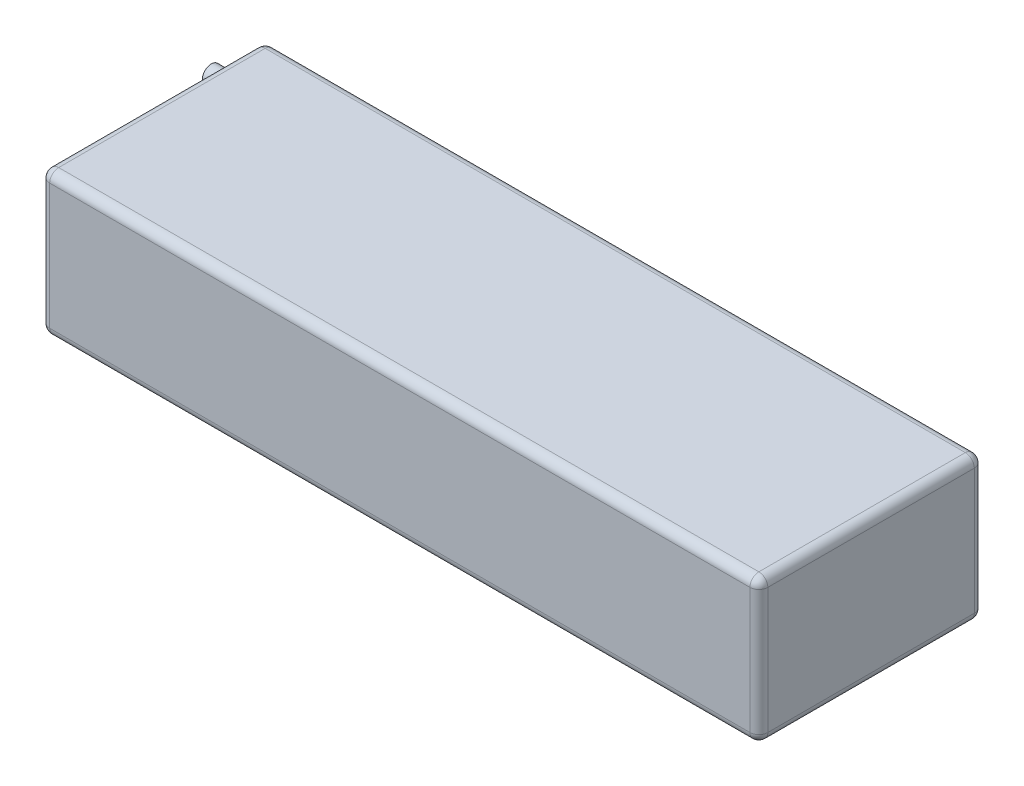
ISO-10303-21;
HEADER;
FILE_DESCRIPTION(('STEP AP214'),'2;1');
FILE_NAME('part.step','',(''),(''),'','','');
FILE_SCHEMA(('AUTOMOTIVE_DESIGN { 1 0 10303 214 1 1 1 1 }'));
ENDSEC;
DATA;
#1=APPLICATION_CONTEXT('core data for automotive mechanical design processes');
#2=APPLICATION_PROTOCOL_DEFINITION('international standard','automotive_design',2000,#1);
#3=PRODUCT_CONTEXT('',#1,'mechanical');
#4=PRODUCT('Part','Part','',(#3));
#5=PRODUCT_RELATED_PRODUCT_CATEGORY('part','',(#4));
#6=PRODUCT_DEFINITION_FORMATION('','',#4);
#7=PRODUCT_DEFINITION_CONTEXT('part definition',#1,'design');
#8=PRODUCT_DEFINITION('design','',#6,#7);
#9=PRODUCT_DEFINITION_SHAPE('','',#8);
#10=(LENGTH_UNIT() NAMED_UNIT(*) SI_UNIT(.MILLI.,.METRE.));
#11=(NAMED_UNIT(*) PLANE_ANGLE_UNIT() SI_UNIT($,.RADIAN.));
#12=(NAMED_UNIT(*) SI_UNIT($,.STERADIAN.) SOLID_ANGLE_UNIT());
#13=UNCERTAINTY_MEASURE_WITH_UNIT(LENGTH_MEASURE(1.E-05),#10,'distance_accuracy_value','');
#14=(GEOMETRIC_REPRESENTATION_CONTEXT(3) GLOBAL_UNCERTAINTY_ASSIGNED_CONTEXT((#13)) GLOBAL_UNIT_ASSIGNED_CONTEXT((#10,
#11,#12)) REPRESENTATION_CONTEXT('',''));
#15=CARTESIAN_POINT('',(0.,0.,0.));
#16=DIRECTION('',(0.,0.,1.));
#17=DIRECTION('',(1.,0.,0.));
#18=AXIS2_PLACEMENT_3D('',#15,#16,#17);
#19=CARTESIAN_POINT('',(-80.,32.,25.));
#20=DIRECTION('',(1.,0.,0.));
#21=DIRECTION('',(0.,0.,-1.));
#22=AXIS2_PLACEMENT_3D('',#19,#20,#21);
#23=PLANE('',#22);
#24=CARTESIAN_POINT('',(-80.,11.,-23.));
#25=DIRECTION('',(1.,0.,0.));
#26=DIRECTION('',(0.,0.,-1.));
#27=AXIS2_PLACEMENT_3D('',#24,#25,#26);
#28=CIRCLE('',#27,2.);
#29=CARTESIAN_POINT('',(-80.,9.,-23.));
#30=VERTEX_POINT('',#29);
#31=CARTESIAN_POINT('',(-80.,13.,-23.));
#32=VERTEX_POINT('',#31);
#33=EDGE_CURVE('E48',#30,#32,#28,.F.);
#34=ORIENTED_EDGE('',*,*,#33,.F.);
#35=DIRECTION('',(0.,-1.,0.));
#36=VECTOR('',#35,1.);
#37=CARTESIAN_POINT('',(-80.,32.,-23.));
#38=LINE('',#37,#36);
#39=CARTESIAN_POINT('',(-80.,2.,-23.));
#40=VERTEX_POINT('',#39);
#41=EDGE_CURVE('E166',#30,#40,#38,.T.);
#42=ORIENTED_EDGE('',*,*,#41,.T.);
#43=DIRECTION('',(0.,0.,1.));
#44=VECTOR('',#43,1.);
#45=CARTESIAN_POINT('',(-80.,2.,25.));
#46=LINE('',#45,#44);
#47=CARTESIAN_POINT('',(-80.,2.,23.));
#48=VERTEX_POINT('',#47);
#49=EDGE_CURVE('E203',#40,#48,#46,.T.);
#50=ORIENTED_EDGE('',*,*,#49,.T.);
#51=DIRECTION('',(0.,-1.,0.));
#52=VECTOR('',#51,1.);
#53=CARTESIAN_POINT('',(-80.,32.,23.));
#54=LINE('',#53,#52);
#55=CARTESIAN_POINT('',(-80.,30.,23.));
#56=VERTEX_POINT('',#55);
#57=EDGE_CURVE('E201',#48,#56,#54,.F.);
#58=ORIENTED_EDGE('',*,*,#57,.T.);
#59=DIRECTION('',(0.,0.,1.));
#60=VECTOR('',#59,1.);
#61=CARTESIAN_POINT('',(-80.,30.,-25.));
#62=LINE('',#61,#60);
#63=CARTESIAN_POINT('',(-80.,30.,-23.));
#64=VERTEX_POINT('',#63);
#65=EDGE_CURVE('E199',#56,#64,#62,.F.);
#66=ORIENTED_EDGE('',*,*,#65,.T.);
#67=CARTESIAN_POINT('',(-80.,23.,-23.));
#68=VERTEX_POINT('',#67);
#69=EDGE_CURVE('E195',#64,#68,#38,.T.);
#70=ORIENTED_EDGE('',*,*,#69,.T.);
#71=CARTESIAN_POINT('',(-80.,21.,-23.));
#72=DIRECTION('',(1.,0.,0.));
#73=DIRECTION('',(0.,0.,-1.));
#74=AXIS2_PLACEMENT_3D('',#71,#72,#73);
#75=CIRCLE('',#74,2.00000000000001);
#76=CARTESIAN_POINT('',(-80.,19.,-23.));
#77=VERTEX_POINT('',#76);
#78=EDGE_CURVE('E206',#77,#68,#75,.F.);
#79=ORIENTED_EDGE('',*,*,#78,.F.);
#80=CARTESIAN_POINT('',(-80.,18.,-23.));
#81=VERTEX_POINT('',#80);
#82=EDGE_CURVE('E198',#77,#81,#38,.T.);
#83=ORIENTED_EDGE('',*,*,#82,.T.);
#84=CARTESIAN_POINT('',(-80.,16.,-23.));
#85=DIRECTION('',(1.,0.,0.));
#86=DIRECTION('',(0.,0.,-1.));
#87=AXIS2_PLACEMENT_3D('',#84,#85,#86);
#88=CIRCLE('',#87,2.);
#89=CARTESIAN_POINT('',(-80.,14.,-23.));
#90=VERTEX_POINT('',#89);
#91=EDGE_CURVE('E56',#90,#81,#88,.F.);
#92=ORIENTED_EDGE('',*,*,#91,.F.);
#93=EDGE_CURVE('E689',#90,#32,#38,.T.);
#94=ORIENTED_EDGE('',*,*,#93,.T.);
#95=EDGE_LOOP('',(#34,#42,#50,#58,#66,#70,#79,#83,#92,#94));
#96=FACE_BOUND('',#95,.T.);
#97=ADVANCED_FACE('F33',(#96),#23,.F.);
#98=CARTESIAN_POINT('',(-78.,32.,-23.));
#99=DIRECTION('',(0.,-1.,0.));
#100=DIRECTION('',(0.,0.,-1.));
#101=AXIS2_PLACEMENT_3D('',#98,#99,#100);
#102=CYLINDRICAL_SURFACE('',#101,2.);
#103=ORIENTED_EDGE('',*,*,#41,.F.);
#104=CARTESIAN_POINT('',(-78.,11.,-23.));
#105=DIRECTION('',(0.707106781186547,-0.707106781186547,0.));
#106=DIRECTION('',(-0.707106781186547,-0.707106781186547,0.));
#107=AXIS2_PLACEMENT_3D('',#104,#105,#106);
#108=ELLIPSE('',#107,2.82842712474619,2.);
#109=CARTESIAN_POINT('',(-78.,11.,-25.));
#110=VERTEX_POINT('',#109);
#111=EDGE_CURVE('E151',#30,#110,#108,.T.);
#112=ORIENTED_EDGE('',*,*,#111,.T.);
#113=DIRECTION('',(0.,-1.,0.));
#114=VECTOR('',#113,1.);
#115=CARTESIAN_POINT('',(-78.,32.,-25.));
#116=LINE('',#115,#114);
#117=CARTESIAN_POINT('',(-78.,2.,-25.));
#118=VERTEX_POINT('',#117);
#119=EDGE_CURVE('E164',#118,#110,#116,.F.);
#120=ORIENTED_EDGE('',*,*,#119,.F.);
#121=CARTESIAN_POINT('',(-78.,2.,-23.));
#122=DIRECTION('',(0.,-1.,0.));
#123=DIRECTION('',(0.,0.,-1.));
#124=AXIS2_PLACEMENT_3D('',#121,#122,#123);
#125=CIRCLE('',#124,2.);
#126=EDGE_CURVE('E208',#118,#40,#125,.F.);
#127=ORIENTED_EDGE('',*,*,#126,.T.);
#128=EDGE_LOOP('',(#103,#112,#120,#127));
#129=FACE_BOUND('',#128,.T.);
#130=ADVANCED_FACE('F161',(#129),#102,.T.);
#131=CARTESIAN_POINT('',(-78.,16.,-25.));
#132=VERTEX_POINT('',#131);
#133=EDGE_CURVE('E170',#110,#132,#116,.F.);
#134=ORIENTED_EDGE('',*,*,#133,.F.);
#135=CARTESIAN_POINT('',(-78.,11.,-23.));
#136=DIRECTION('',(-0.707106781186547,-0.707106781186547,0.));
#137=DIRECTION('',(0.707106781186547,-0.707106781186547,0.));
#138=AXIS2_PLACEMENT_3D('',#135,#136,#137);
#139=ELLIPSE('',#138,2.82842712474619,2.);
#140=EDGE_CURVE('E147',#110,#32,#139,.F.);
#141=ORIENTED_EDGE('',*,*,#140,.T.);
#142=ORIENTED_EDGE('',*,*,#93,.F.);
#143=CARTESIAN_POINT('',(-78.,16.,-23.));
#144=DIRECTION('',(0.707106781186547,-0.707106781186547,0.));
#145=DIRECTION('',(-0.707106781186547,-0.707106781186547,0.));
#146=AXIS2_PLACEMENT_3D('',#143,#144,#145);
#147=ELLIPSE('',#146,2.82842712474619,2.);
#148=EDGE_CURVE('E172',#90,#132,#147,.T.);
#149=ORIENTED_EDGE('',*,*,#148,.T.);
#150=EDGE_LOOP('',(#134,#141,#142,#149));
#151=FACE_BOUND('',#150,.T.);
#152=ADVANCED_FACE('F171',(#151),#102,.T.);
#153=CARTESIAN_POINT('',(-78.,21.,-25.));
#154=VERTEX_POINT('',#153);
#155=EDGE_CURVE('E175',#132,#154,#116,.F.);
#156=ORIENTED_EDGE('',*,*,#155,.F.);
#157=CARTESIAN_POINT('',(-78.,16.,-23.));
#158=DIRECTION('',(-0.707106781186547,-0.707106781186547,0.));
#159=DIRECTION('',(0.707106781186547,-0.707106781186547,0.));
#160=AXIS2_PLACEMENT_3D('',#157,#158,#159);
#161=ELLIPSE('',#160,2.82842712474619,2.);
#162=EDGE_CURVE('E214',#132,#81,#161,.F.);
#163=ORIENTED_EDGE('',*,*,#162,.T.);
#164=ORIENTED_EDGE('',*,*,#82,.F.);
#165=CARTESIAN_POINT('',(-78.,21.,-23.));
#166=DIRECTION('',(0.707106781186547,-0.707106781186547,0.));
#167=DIRECTION('',(-0.707106781186547,-0.707106781186547,0.));
#168=AXIS2_PLACEMENT_3D('',#165,#166,#167);
#169=ELLIPSE('',#168,2.82842712474619,2.);
#170=EDGE_CURVE('E11',#77,#154,#169,.T.);
#171=ORIENTED_EDGE('',*,*,#170,.T.);
#172=EDGE_LOOP('',(#156,#163,#164,#171));
#173=FACE_BOUND('',#172,.T.);
#174=ADVANCED_FACE('F479',(#173),#102,.T.);
#175=CARTESIAN_POINT('',(-78.,30.,-25.));
#176=VERTEX_POINT('',#175);
#177=EDGE_CURVE('E182',#154,#176,#116,.F.);
#178=ORIENTED_EDGE('',*,*,#177,.F.);
#179=CARTESIAN_POINT('',(-78.,21.,-23.));
#180=DIRECTION('',(-0.707106781186547,-0.707106781186547,0.));
#181=DIRECTION('',(0.707106781186547,-0.707106781186547,0.));
#182=AXIS2_PLACEMENT_3D('',#179,#180,#181);
#183=ELLIPSE('',#182,2.82842712474619,2.);
#184=EDGE_CURVE('E41',#154,#68,#183,.F.);
#185=ORIENTED_EDGE('',*,*,#184,.T.);
#186=ORIENTED_EDGE('',*,*,#69,.F.);
#187=CARTESIAN_POINT('',(-78.,30.,-23.));
#188=DIRECTION('',(0.,1.,0.));
#189=DIRECTION('',(0.,0.,1.));
#190=AXIS2_PLACEMENT_3D('',#187,#188,#189);
#191=CIRCLE('',#190,2.);
#192=EDGE_CURVE('E370',#64,#176,#191,.F.);
#193=ORIENTED_EDGE('',*,*,#192,.T.);
#194=EDGE_LOOP('',(#178,#185,#186,#193));
#195=FACE_BOUND('',#194,.T.);
#196=ADVANCED_FACE('F241',(#195),#102,.T.);
#197=CARTESIAN_POINT('',(80.,32.,25.));
#198=DIRECTION('',(0.,0.,-1.));
#199=DIRECTION('',(-1.,0.,0.));
#200=AXIS2_PLACEMENT_3D('',#197,#198,#199);
#201=PLANE('',#200);
#202=DIRECTION('',(1.,0.,0.));
#203=VECTOR('',#202,1.);
#204=CARTESIAN_POINT('',(-80.,30.,25.));
#205=LINE('',#204,#203);
#206=CARTESIAN_POINT('',(78.,30.,25.));
#207=VERTEX_POINT('',#206);
#208=CARTESIAN_POINT('',(-78.,30.,25.));
#209=VERTEX_POINT('',#208);
#210=EDGE_CURVE('E336',#207,#209,#205,.F.);
#211=ORIENTED_EDGE('',*,*,#210,.T.);
#212=DIRECTION('',(0.,-1.,0.));
#213=VECTOR('',#212,1.);
#214=CARTESIAN_POINT('',(-78.,32.,25.));
#215=LINE('',#214,#213);
#216=CARTESIAN_POINT('',(-78.,2.,25.));
#217=VERTEX_POINT('',#216);
#218=EDGE_CURVE('E343',#209,#217,#215,.T.);
#219=ORIENTED_EDGE('',*,*,#218,.T.);
#220=DIRECTION('',(1.,0.,0.));
#221=VECTOR('',#220,1.);
#222=CARTESIAN_POINT('',(80.,2.,25.));
#223=LINE('',#222,#221);
#224=CARTESIAN_POINT('',(78.,2.,25.));
#225=VERTEX_POINT('',#224);
#226=EDGE_CURVE('E348',#217,#225,#223,.T.);
#227=ORIENTED_EDGE('',*,*,#226,.T.);
#228=DIRECTION('',(0.,-1.,0.));
#229=VECTOR('',#228,1.);
#230=CARTESIAN_POINT('',(78.,32.,25.));
#231=LINE('',#230,#229);
#232=EDGE_CURVE('E344',#225,#207,#231,.F.);
#233=ORIENTED_EDGE('',*,*,#232,.T.);
#234=EDGE_LOOP('',(#211,#219,#227,#233));
#235=FACE_BOUND('',#234,.T.);
#236=ADVANCED_FACE('F243',(#235),#201,.F.);
#237=CARTESIAN_POINT('',(80.,32.,25.));
#238=DIRECTION('',(-1.,0.,0.));
#239=DIRECTION('',(0.,0.,1.));
#240=AXIS2_PLACEMENT_3D('',#237,#238,#239);
#241=PLANE('',#240);
#242=DIRECTION('',(0.,0.,-1.));
#243=VECTOR('',#242,1.);
#244=CARTESIAN_POINT('',(80.,30.,25.));
#245=LINE('',#244,#243);
#246=CARTESIAN_POINT('',(80.,30.,-23.));
#247=VERTEX_POINT('',#246);
#248=CARTESIAN_POINT('',(80.,30.,23.));
#249=VERTEX_POINT('',#248);
#250=EDGE_CURVE('E355',#247,#249,#245,.F.);
#251=ORIENTED_EDGE('',*,*,#250,.T.);
#252=DIRECTION('',(0.,-1.,0.));
#253=VECTOR('',#252,1.);
#254=CARTESIAN_POINT('',(80.,32.,23.));
#255=LINE('',#254,#253);
#256=CARTESIAN_POINT('',(80.,2.,23.));
#257=VERTEX_POINT('',#256);
#258=EDGE_CURVE('E357',#249,#257,#255,.T.);
#259=ORIENTED_EDGE('',*,*,#258,.T.);
#260=DIRECTION('',(0.,0.,-1.));
#261=VECTOR('',#260,1.);
#262=CARTESIAN_POINT('',(80.,2.,25.));
#263=LINE('',#262,#261);
#264=CARTESIAN_POINT('',(80.,2.,-23.));
#265=VERTEX_POINT('',#264);
#266=EDGE_CURVE('E346',#257,#265,#263,.T.);
#267=ORIENTED_EDGE('',*,*,#266,.T.);
#268=DIRECTION('',(0.,-1.,0.));
#269=VECTOR('',#268,1.);
#270=CARTESIAN_POINT('',(80.,32.,-23.));
#271=LINE('',#270,#269);
#272=EDGE_CURVE('E353',#265,#247,#271,.F.);
#273=ORIENTED_EDGE('',*,*,#272,.T.);
#274=EDGE_LOOP('',(#251,#259,#267,#273));
#275=FACE_BOUND('',#274,.T.);
#276=ADVANCED_FACE('F467',(#275),#241,.F.);
#277=CARTESIAN_POINT('',(80.,32.,-25.));
#278=DIRECTION('',(0.,0.,1.));
#279=DIRECTION('',(1.,0.,0.));
#280=AXIS2_PLACEMENT_3D('',#277,#278,#279);
#281=PLANE('',#280);
#282=ORIENTED_EDGE('',*,*,#119,.T.);
#283=ORIENTED_EDGE('',*,*,#133,.T.);
#284=ORIENTED_EDGE('',*,*,#155,.T.);
#285=ORIENTED_EDGE('',*,*,#177,.T.);
#286=DIRECTION('',(-1.,0.,0.));
#287=VECTOR('',#286,1.);
#288=CARTESIAN_POINT('',(80.,30.,-25.));
#289=LINE('',#288,#287);
#290=CARTESIAN_POINT('',(78.,30.,-25.));
#291=VERTEX_POINT('',#290);
#292=EDGE_CURVE('E186',#176,#291,#289,.F.);
#293=ORIENTED_EDGE('',*,*,#292,.T.);
#294=DIRECTION('',(0.,-1.,0.));
#295=VECTOR('',#294,1.);
#296=CARTESIAN_POINT('',(78.,32.,-25.));
#297=LINE('',#296,#295);
#298=CARTESIAN_POINT('',(78.,2.,-25.));
#299=VERTEX_POINT('',#298);
#300=EDGE_CURVE('E189',#291,#299,#297,.T.);
#301=ORIENTED_EDGE('',*,*,#300,.T.);
#302=DIRECTION('',(-1.,0.,0.));
#303=VECTOR('',#302,1.);
#304=CARTESIAN_POINT('',(80.,2.,-25.));
#305=LINE('',#304,#303);
#306=EDGE_CURVE('E179',#299,#118,#305,.T.);
#307=ORIENTED_EDGE('',*,*,#306,.T.);
#308=EDGE_LOOP('',(#282,#283,#284,#285,#293,#301,#307));
#309=FACE_BOUND('',#308,.T.);
#310=ADVANCED_FACE('F177',(#309),#281,.F.);
#311=CARTESIAN_POINT('',(0.,32.,0.));
#312=DIRECTION('',(0.,1.,0.));
#313=DIRECTION('',(0.,0.,1.));
#314=AXIS2_PLACEMENT_3D('',#311,#312,#313);
#315=PLANE('',#314);
#316=DIRECTION('',(0.,0.,-1.));
#317=VECTOR('',#316,1.);
#318=CARTESIAN_POINT('',(78.,32.,-25.));
#319=LINE('',#318,#317);
#320=CARTESIAN_POINT('',(78.,32.,23.));
#321=VERTEX_POINT('',#320);
#322=CARTESIAN_POINT('',(78.,32.,-23.));
#323=VERTEX_POINT('',#322);
#324=EDGE_CURVE('E181',#321,#323,#319,.T.);
#325=ORIENTED_EDGE('',*,*,#324,.T.);
#326=DIRECTION('',(-1.,0.,0.));
#327=VECTOR('',#326,1.);
#328=CARTESIAN_POINT('',(-80.,32.,-23.));
#329=LINE('',#328,#327);
#330=CARTESIAN_POINT('',(-78.,32.,-23.));
#331=VERTEX_POINT('',#330);
#332=EDGE_CURVE('E443',#323,#331,#329,.T.);
#333=ORIENTED_EDGE('',*,*,#332,.T.);
#334=DIRECTION('',(0.,0.,1.));
#335=VECTOR('',#334,1.);
#336=CARTESIAN_POINT('',(-78.,32.,25.));
#337=LINE('',#336,#335);
#338=CARTESIAN_POINT('',(-78.,32.,23.));
#339=VERTEX_POINT('',#338);
#340=EDGE_CURVE('E438',#331,#339,#337,.T.);
#341=ORIENTED_EDGE('',*,*,#340,.T.);
#342=DIRECTION('',(1.,0.,0.));
#343=VECTOR('',#342,1.);
#344=CARTESIAN_POINT('',(80.,32.,23.));
#345=LINE('',#344,#343);
#346=EDGE_CURVE('E183',#339,#321,#345,.T.);
#347=ORIENTED_EDGE('',*,*,#346,.T.);
#348=EDGE_LOOP('',(#325,#333,#341,#347));
#349=FACE_BOUND('',#348,.T.);
#350=ADVANCED_FACE('F470',(#349),#315,.T.);
#351=CARTESIAN_POINT('',(0.,0.,0.));
#352=DIRECTION('',(0.,1.,0.));
#353=DIRECTION('',(0.,0.,1.));
#354=AXIS2_PLACEMENT_3D('',#351,#352,#353);
#355=PLANE('',#354);
#356=DIRECTION('',(0.,0.,-1.));
#357=VECTOR('',#356,1.);
#358=CARTESIAN_POINT('',(78.,0.,0.));
#359=LINE('',#358,#357);
#360=CARTESIAN_POINT('',(78.,0.,-23.));
#361=VERTEX_POINT('',#360);
#362=CARTESIAN_POINT('',(78.,0.,23.));
#363=VERTEX_POINT('',#362);
#364=EDGE_CURVE('E364',#361,#363,#359,.F.);
#365=ORIENTED_EDGE('',*,*,#364,.T.);
#366=DIRECTION('',(1.,0.,0.));
#367=VECTOR('',#366,1.);
#368=CARTESIAN_POINT('',(0.,0.,23.));
#369=LINE('',#368,#367);
#370=CARTESIAN_POINT('',(-78.,0.,23.));
#371=VERTEX_POINT('',#370);
#372=EDGE_CURVE('E366',#363,#371,#369,.F.);
#373=ORIENTED_EDGE('',*,*,#372,.T.);
#374=DIRECTION('',(0.,0.,1.));
#375=VECTOR('',#374,1.);
#376=CARTESIAN_POINT('',(-78.,0.,0.));
#377=LINE('',#376,#375);
#378=CARTESIAN_POINT('',(-78.,0.,-23.));
#379=VERTEX_POINT('',#378);
#380=EDGE_CURVE('E360',#371,#379,#377,.F.);
#381=ORIENTED_EDGE('',*,*,#380,.T.);
#382=DIRECTION('',(-1.,0.,0.));
#383=VECTOR('',#382,1.);
#384=CARTESIAN_POINT('',(0.,0.,-23.));
#385=LINE('',#384,#383);
#386=EDGE_CURVE('E362',#379,#361,#385,.F.);
#387=ORIENTED_EDGE('',*,*,#386,.T.);
#388=EDGE_LOOP('',(#365,#373,#381,#387));
#389=FACE_BOUND('',#388,.T.);
#390=ADVANCED_FACE('F320',(#389),#355,.F.);
#391=CARTESIAN_POINT('',(78.,32.,23.));
#392=DIRECTION('',(0.,-1.,0.));
#393=DIRECTION('',(0.,0.,-1.));
#394=AXIS2_PLACEMENT_3D('',#391,#392,#393);
#395=CYLINDRICAL_SURFACE('',#394,2.);
#396=CARTESIAN_POINT('',(78.,30.,23.));
#397=DIRECTION('',(0.,1.,0.));
#398=DIRECTION('',(0.,0.,1.));
#399=AXIS2_PLACEMENT_3D('',#396,#397,#398);
#400=CIRCLE('',#399,2.);
#401=EDGE_CURVE('E205',#207,#249,#400,.T.);
#402=ORIENTED_EDGE('',*,*,#401,.F.);
#403=ORIENTED_EDGE('',*,*,#232,.F.);
#404=CARTESIAN_POINT('',(78.,2.,23.));
#405=DIRECTION('',(0.,-1.,0.));
#406=DIRECTION('',(0.,0.,-1.));
#407=AXIS2_PLACEMENT_3D('',#404,#405,#406);
#408=CIRCLE('',#407,2.);
#409=EDGE_CURVE('E421',#257,#225,#408,.T.);
#410=ORIENTED_EDGE('',*,*,#409,.F.);
#411=ORIENTED_EDGE('',*,*,#258,.F.);
#412=EDGE_LOOP('',(#402,#403,#410,#411));
#413=FACE_BOUND('',#412,.T.);
#414=ADVANCED_FACE('F35',(#413),#395,.T.);
#415=CARTESIAN_POINT('',(78.,30.,23.));
#416=DIRECTION('',(0.,0.,1.));
#417=DIRECTION('',(1.,0.,0.));
#418=AXIS2_PLACEMENT_3D('',#415,#416,#417);
#419=SPHERICAL_SURFACE('',#418,2.);
#420=CARTESIAN_POINT('',(78.,30.,23.));
#421=DIRECTION('',(1.,0.,0.));
#422=DIRECTION('',(0.,0.,-1.));
#423=AXIS2_PLACEMENT_3D('',#420,#421,#422);
#424=CIRCLE('',#423,2.);
#425=EDGE_CURVE('E326',#207,#321,#424,.F.);
#426=ORIENTED_EDGE('',*,*,#425,.F.);
#427=ORIENTED_EDGE('',*,*,#401,.T.);
#428=CARTESIAN_POINT('',(78.,30.,23.));
#429=DIRECTION('',(0.,0.,1.));
#430=DIRECTION('',(1.,0.,0.));
#431=AXIS2_PLACEMENT_3D('',#428,#429,#430);
#432=CIRCLE('',#431,2.);
#433=EDGE_CURVE('E330',#321,#249,#432,.F.);
#434=ORIENTED_EDGE('',*,*,#433,.F.);
#435=EDGE_LOOP('',(#426,#427,#434));
#436=FACE_BOUND('',#435,.T.);
#437=ADVANCED_FACE('F313',(#436),#419,.T.);
#438=CARTESIAN_POINT('',(78.,2.,23.));
#439=DIRECTION('',(0.,0.,1.));
#440=DIRECTION('',(1.,0.,0.));
#441=AXIS2_PLACEMENT_3D('',#438,#439,#440);
#442=SPHERICAL_SURFACE('',#441,2.);
#443=CARTESIAN_POINT('',(78.,2.,23.));
#444=DIRECTION('',(0.,0.,1.));
#445=DIRECTION('',(1.,0.,0.));
#446=AXIS2_PLACEMENT_3D('',#443,#444,#445);
#447=CIRCLE('',#446,2.);
#448=EDGE_CURVE('E415',#257,#363,#447,.F.);
#449=ORIENTED_EDGE('',*,*,#448,.F.);
#450=ORIENTED_EDGE('',*,*,#409,.T.);
#451=CARTESIAN_POINT('',(78.,2.,23.));
#452=DIRECTION('',(1.,0.,0.));
#453=DIRECTION('',(0.,0.,-1.));
#454=AXIS2_PLACEMENT_3D('',#451,#452,#453);
#455=CIRCLE('',#454,2.);
#456=EDGE_CURVE('E333',#363,#225,#455,.F.);
#457=ORIENTED_EDGE('',*,*,#456,.F.);
#458=EDGE_LOOP('',(#449,#450,#457));
#459=FACE_BOUND('',#458,.T.);
#460=ADVANCED_FACE('F310',(#459),#442,.T.);
#461=CARTESIAN_POINT('',(78.,30.,0.));
#462=DIRECTION('',(0.,0.,1.));
#463=DIRECTION('',(1.,0.,0.));
#464=AXIS2_PLACEMENT_3D('',#461,#462,#463);
#465=CYLINDRICAL_SURFACE('',#464,2.);
#466=ORIENTED_EDGE('',*,*,#433,.T.);
#467=ORIENTED_EDGE('',*,*,#250,.F.);
#468=CARTESIAN_POINT('',(78.,30.,-23.));
#469=DIRECTION('',(0.,0.,-1.));
#470=DIRECTION('',(-1.,0.,0.));
#471=AXIS2_PLACEMENT_3D('',#468,#469,#470);
#472=CIRCLE('',#471,2.);
#473=EDGE_CURVE('E409',#323,#247,#472,.T.);
#474=ORIENTED_EDGE('',*,*,#473,.F.);
#475=ORIENTED_EDGE('',*,*,#324,.F.);
#476=EDGE_LOOP('',(#466,#467,#474,#475));
#477=FACE_BOUND('',#476,.T.);
#478=ADVANCED_FACE('F306',(#477),#465,.T.);
#479=CARTESIAN_POINT('',(0.,30.,23.));
#480=DIRECTION('',(-1.,0.,0.));
#481=DIRECTION('',(0.,0.,1.));
#482=AXIS2_PLACEMENT_3D('',#479,#480,#481);
#483=CYLINDRICAL_SURFACE('',#482,2.);
#484=ORIENTED_EDGE('',*,*,#425,.T.);
#485=ORIENTED_EDGE('',*,*,#346,.F.);
#486=CARTESIAN_POINT('',(-78.,30.,23.));
#487=DIRECTION('',(-1.,0.,0.));
#488=DIRECTION('',(0.,-1.,0.));
#489=AXIS2_PLACEMENT_3D('',#486,#487,#488);
#490=CIRCLE('',#489,2.);
#491=EDGE_CURVE('E338',#209,#339,#490,.T.);
#492=ORIENTED_EDGE('',*,*,#491,.F.);
#493=ORIENTED_EDGE('',*,*,#210,.F.);
#494=EDGE_LOOP('',(#484,#485,#492,#493));
#495=FACE_BOUND('',#494,.T.);
#496=ADVANCED_FACE('F302',(#495),#483,.T.);
#497=CARTESIAN_POINT('',(-78.,32.,23.));
#498=DIRECTION('',(0.,-1.,0.));
#499=DIRECTION('',(0.,0.,-1.));
#500=AXIS2_PLACEMENT_3D('',#497,#498,#499);
#501=CYLINDRICAL_SURFACE('',#500,2.);
#502=CARTESIAN_POINT('',(-78.,2.,23.));
#503=DIRECTION('',(0.,-1.,0.));
#504=DIRECTION('',(0.,0.,-1.));
#505=AXIS2_PLACEMENT_3D('',#502,#503,#504);
#506=CIRCLE('',#505,2.);
#507=EDGE_CURVE('E403',#217,#48,#506,.T.);
#508=ORIENTED_EDGE('',*,*,#507,.F.);
#509=ORIENTED_EDGE('',*,*,#218,.F.);
#510=CARTESIAN_POINT('',(-78.,30.,23.));
#511=DIRECTION('',(0.,1.,0.));
#512=DIRECTION('',(0.,0.,1.));
#513=AXIS2_PLACEMENT_3D('',#510,#511,#512);
#514=CIRCLE('',#513,2.);
#515=EDGE_CURVE('E406',#56,#209,#514,.T.);
#516=ORIENTED_EDGE('',*,*,#515,.F.);
#517=ORIENTED_EDGE('',*,*,#57,.F.);
#518=EDGE_LOOP('',(#508,#509,#516,#517));
#519=FACE_BOUND('',#518,.T.);
#520=ADVANCED_FACE('F298',(#519),#501,.T.);
#521=CARTESIAN_POINT('',(80.,2.,23.));
#522=DIRECTION('',(1.,0.,0.));
#523=DIRECTION('',(0.,0.,-1.));
#524=AXIS2_PLACEMENT_3D('',#521,#522,#523);
#525=CYLINDRICAL_SURFACE('',#524,2.);
#526=ORIENTED_EDGE('',*,*,#456,.T.);
#527=ORIENTED_EDGE('',*,*,#226,.F.);
#528=CARTESIAN_POINT('',(-78.,2.,23.));
#529=DIRECTION('',(-1.,0.,0.));
#530=DIRECTION('',(0.,0.,1.));
#531=AXIS2_PLACEMENT_3D('',#528,#529,#530);
#532=CIRCLE('',#531,2.);
#533=EDGE_CURVE('E401',#371,#217,#532,.T.);
#534=ORIENTED_EDGE('',*,*,#533,.F.);
#535=ORIENTED_EDGE('',*,*,#372,.F.);
#536=EDGE_LOOP('',(#526,#527,#534,#535));
#537=FACE_BOUND('',#536,.T.);
#538=ADVANCED_FACE('F294',(#537),#525,.T.);
#539=CARTESIAN_POINT('',(78.,2.,25.));
#540=DIRECTION('',(0.,0.,-1.));
#541=DIRECTION('',(-1.,0.,0.));
#542=AXIS2_PLACEMENT_3D('',#539,#540,#541);
#543=CYLINDRICAL_SURFACE('',#542,2.);
#544=ORIENTED_EDGE('',*,*,#448,.T.);
#545=ORIENTED_EDGE('',*,*,#364,.F.);
#546=CARTESIAN_POINT('',(78.,2.,-23.));
#547=DIRECTION('',(0.,0.,-1.));
#548=DIRECTION('',(-1.,0.,0.));
#549=AXIS2_PLACEMENT_3D('',#546,#547,#548);
#550=CIRCLE('',#549,2.);
#551=EDGE_CURVE('E398',#265,#361,#550,.T.);
#552=ORIENTED_EDGE('',*,*,#551,.F.);
#553=ORIENTED_EDGE('',*,*,#266,.F.);
#554=EDGE_LOOP('',(#544,#545,#552,#553));
#555=FACE_BOUND('',#554,.T.);
#556=ADVANCED_FACE('F290',(#555),#543,.T.);
#557=CARTESIAN_POINT('',(78.,32.,-23.));
#558=DIRECTION('',(0.,-1.,0.));
#559=DIRECTION('',(0.,0.,-1.));
#560=AXIS2_PLACEMENT_3D('',#557,#558,#559);
#561=CYLINDRICAL_SURFACE('',#560,2.);
#562=CARTESIAN_POINT('',(78.,30.,-23.));
#563=DIRECTION('',(0.,1.,0.));
#564=DIRECTION('',(0.,0.,1.));
#565=AXIS2_PLACEMENT_3D('',#562,#563,#564);
#566=CIRCLE('',#565,2.);
#567=EDGE_CURVE('E412',#247,#291,#566,.T.);
#568=ORIENTED_EDGE('',*,*,#567,.F.);
#569=ORIENTED_EDGE('',*,*,#272,.F.);
#570=CARTESIAN_POINT('',(78.,2.,-23.));
#571=DIRECTION('',(0.,-1.,0.));
#572=DIRECTION('',(0.,0.,-1.));
#573=AXIS2_PLACEMENT_3D('',#570,#571,#572);
#574=CIRCLE('',#573,2.);
#575=EDGE_CURVE('E395',#299,#265,#574,.T.);
#576=ORIENTED_EDGE('',*,*,#575,.F.);
#577=ORIENTED_EDGE('',*,*,#300,.F.);
#578=EDGE_LOOP('',(#568,#569,#576,#577));
#579=FACE_BOUND('',#578,.T.);
#580=ADVANCED_FACE('F286',(#579),#561,.T.);
#581=CARTESIAN_POINT('',(78.,30.,-23.));
#582=DIRECTION('',(0.,0.,1.));
#583=DIRECTION('',(1.,0.,0.));
#584=AXIS2_PLACEMENT_3D('',#581,#582,#583);
#585=SPHERICAL_SURFACE('',#584,2.);
#586=ORIENTED_EDGE('',*,*,#473,.T.);
#587=ORIENTED_EDGE('',*,*,#567,.T.);
#588=CARTESIAN_POINT('',(78.,30.,-23.));
#589=DIRECTION('',(1.,0.,0.));
#590=DIRECTION('',(0.,0.,-1.));
#591=AXIS2_PLACEMENT_3D('',#588,#589,#590);
#592=CIRCLE('',#591,2.);
#593=EDGE_CURVE('E392',#323,#291,#592,.F.);
#594=ORIENTED_EDGE('',*,*,#593,.F.);
#595=EDGE_LOOP('',(#586,#587,#594));
#596=FACE_BOUND('',#595,.T.);
#597=ADVANCED_FACE('F282',(#596),#585,.T.);
#598=CARTESIAN_POINT('',(-78.,30.,23.));
#599=DIRECTION('',(0.,0.,1.));
#600=DIRECTION('',(1.,0.,0.));
#601=AXIS2_PLACEMENT_3D('',#598,#599,#600);
#602=SPHERICAL_SURFACE('',#601,2.);
#603=ORIENTED_EDGE('',*,*,#515,.T.);
#604=ORIENTED_EDGE('',*,*,#491,.T.);
#605=CARTESIAN_POINT('',(-78.,30.,23.));
#606=DIRECTION('',(0.,0.,1.));
#607=DIRECTION('',(1.,0.,0.));
#608=AXIS2_PLACEMENT_3D('',#605,#606,#607);
#609=CIRCLE('',#608,2.);
#610=EDGE_CURVE('E389',#56,#339,#609,.F.);
#611=ORIENTED_EDGE('',*,*,#610,.F.);
#612=EDGE_LOOP('',(#603,#604,#611));
#613=FACE_BOUND('',#612,.T.);
#614=ADVANCED_FACE('F278',(#613),#602,.T.);
#615=CARTESIAN_POINT('',(-78.,2.,23.));
#616=DIRECTION('',(0.,0.,1.));
#617=DIRECTION('',(1.,0.,0.));
#618=AXIS2_PLACEMENT_3D('',#615,#616,#617);
#619=SPHERICAL_SURFACE('',#618,2.);
#620=ORIENTED_EDGE('',*,*,#533,.T.);
#621=ORIENTED_EDGE('',*,*,#507,.T.);
#622=CARTESIAN_POINT('',(-78.,2.,23.));
#623=DIRECTION('',(0.,0.,1.));
#624=DIRECTION('',(1.,0.,0.));
#625=AXIS2_PLACEMENT_3D('',#622,#623,#624);
#626=CIRCLE('',#625,2.);
#627=EDGE_CURVE('E386',#371,#48,#626,.F.);
#628=ORIENTED_EDGE('',*,*,#627,.F.);
#629=EDGE_LOOP('',(#620,#621,#628));
#630=FACE_BOUND('',#629,.T.);
#631=ADVANCED_FACE('F274',(#630),#619,.T.);
#632=CARTESIAN_POINT('',(78.,2.,-23.));
#633=DIRECTION('',(0.,0.,1.));
#634=DIRECTION('',(1.,0.,0.));
#635=AXIS2_PLACEMENT_3D('',#632,#633,#634);
#636=SPHERICAL_SURFACE('',#635,2.);
#637=ORIENTED_EDGE('',*,*,#575,.T.);
#638=ORIENTED_EDGE('',*,*,#551,.T.);
#639=CARTESIAN_POINT('',(78.,2.,-23.));
#640=DIRECTION('',(1.,0.,0.));
#641=DIRECTION('',(0.,0.,-1.));
#642=AXIS2_PLACEMENT_3D('',#639,#640,#641);
#643=CIRCLE('',#642,2.);
#644=EDGE_CURVE('E383',#299,#361,#643,.F.);
#645=ORIENTED_EDGE('',*,*,#644,.F.);
#646=EDGE_LOOP('',(#637,#638,#645));
#647=FACE_BOUND('',#646,.T.);
#648=ADVANCED_FACE('F270',(#647),#636,.T.);
#649=CARTESIAN_POINT('',(0.,30.,-23.));
#650=DIRECTION('',(1.,0.,0.));
#651=DIRECTION('',(0.,0.,-1.));
#652=AXIS2_PLACEMENT_3D('',#649,#650,#651);
#653=CYLINDRICAL_SURFACE('',#652,2.);
#654=ORIENTED_EDGE('',*,*,#593,.T.);
#655=ORIENTED_EDGE('',*,*,#292,.F.);
#656=CARTESIAN_POINT('',(-78.,30.,-23.));
#657=DIRECTION('',(-1.,0.,0.));
#658=DIRECTION('',(0.,0.,1.));
#659=AXIS2_PLACEMENT_3D('',#656,#657,#658);
#660=CIRCLE('',#659,2.);
#661=EDGE_CURVE('E380',#331,#176,#660,.T.);
#662=ORIENTED_EDGE('',*,*,#661,.F.);
#663=ORIENTED_EDGE('',*,*,#332,.F.);
#664=EDGE_LOOP('',(#654,#655,#662,#663));
#665=FACE_BOUND('',#664,.T.);
#666=ADVANCED_FACE('F266',(#665),#653,.T.);
#667=CARTESIAN_POINT('',(-78.,30.,0.));
#668=DIRECTION('',(0.,0.,-1.));
#669=DIRECTION('',(-1.,0.,0.));
#670=AXIS2_PLACEMENT_3D('',#667,#668,#669);
#671=CYLINDRICAL_SURFACE('',#670,2.);
#672=ORIENTED_EDGE('',*,*,#610,.T.);
#673=ORIENTED_EDGE('',*,*,#340,.F.);
#674=CARTESIAN_POINT('',(-78.,30.,-23.));
#675=DIRECTION('',(0.,0.,-1.));
#676=DIRECTION('',(0.,1.,0.));
#677=AXIS2_PLACEMENT_3D('',#674,#675,#676);
#678=CIRCLE('',#677,2.);
#679=EDGE_CURVE('E378',#64,#331,#678,.T.);
#680=ORIENTED_EDGE('',*,*,#679,.F.);
#681=ORIENTED_EDGE('',*,*,#65,.F.);
#682=EDGE_LOOP('',(#672,#673,#680,#681));
#683=FACE_BOUND('',#682,.T.);
#684=ADVANCED_FACE('F262',(#683),#671,.T.);
#685=CARTESIAN_POINT('',(-78.,2.,25.));
#686=DIRECTION('',(0.,0.,1.));
#687=DIRECTION('',(1.,0.,0.));
#688=AXIS2_PLACEMENT_3D('',#685,#686,#687);
#689=CYLINDRICAL_SURFACE('',#688,2.);
#690=ORIENTED_EDGE('',*,*,#627,.T.);
#691=ORIENTED_EDGE('',*,*,#49,.F.);
#692=CARTESIAN_POINT('',(-78.,2.,-23.));
#693=DIRECTION('',(0.,0.,-1.));
#694=DIRECTION('',(-1.,0.,0.));
#695=AXIS2_PLACEMENT_3D('',#692,#693,#694);
#696=CIRCLE('',#695,2.);
#697=EDGE_CURVE('E375',#379,#40,#696,.T.);
#698=ORIENTED_EDGE('',*,*,#697,.F.);
#699=ORIENTED_EDGE('',*,*,#380,.F.);
#700=EDGE_LOOP('',(#690,#691,#698,#699));
#701=FACE_BOUND('',#700,.T.);
#702=ADVANCED_FACE('F258',(#701),#689,.T.);
#703=CARTESIAN_POINT('',(80.,2.,-23.));
#704=DIRECTION('',(-1.,0.,0.));
#705=DIRECTION('',(0.,0.,1.));
#706=AXIS2_PLACEMENT_3D('',#703,#704,#705);
#707=CYLINDRICAL_SURFACE('',#706,2.);
#708=ORIENTED_EDGE('',*,*,#644,.T.);
#709=ORIENTED_EDGE('',*,*,#386,.F.);
#710=CARTESIAN_POINT('',(-78.,2.,-23.));
#711=DIRECTION('',(-1.,0.,0.));
#712=DIRECTION('',(0.,0.,1.));
#713=AXIS2_PLACEMENT_3D('',#710,#711,#712);
#714=CIRCLE('',#713,2.);
#715=EDGE_CURVE('E372',#118,#379,#714,.T.);
#716=ORIENTED_EDGE('',*,*,#715,.F.);
#717=ORIENTED_EDGE('',*,*,#306,.F.);
#718=EDGE_LOOP('',(#708,#709,#716,#717));
#719=FACE_BOUND('',#718,.T.);
#720=ADVANCED_FACE('F254',(#719),#707,.T.);
#721=CARTESIAN_POINT('',(-78.,30.,-23.));
#722=DIRECTION('',(0.,0.,1.));
#723=DIRECTION('',(1.,0.,0.));
#724=AXIS2_PLACEMENT_3D('',#721,#722,#723);
#725=SPHERICAL_SURFACE('',#724,2.);
#726=ORIENTED_EDGE('',*,*,#679,.T.);
#727=ORIENTED_EDGE('',*,*,#661,.T.);
#728=ORIENTED_EDGE('',*,*,#192,.F.);
#729=EDGE_LOOP('',(#726,#727,#728));
#730=FACE_BOUND('',#729,.T.);
#731=ADVANCED_FACE('F250',(#730),#725,.T.);
#732=CARTESIAN_POINT('',(-78.,2.,-23.));
#733=DIRECTION('',(0.,0.,1.));
#734=DIRECTION('',(1.,0.,0.));
#735=AXIS2_PLACEMENT_3D('',#732,#733,#734);
#736=SPHERICAL_SURFACE('',#735,2.);
#737=ORIENTED_EDGE('',*,*,#715,.T.);
#738=ORIENTED_EDGE('',*,*,#697,.T.);
#739=ORIENTED_EDGE('',*,*,#126,.F.);
#740=EDGE_LOOP('',(#737,#738,#739));
#741=FACE_BOUND('',#740,.T.);
#742=ADVANCED_FACE('F246',(#741),#736,.T.);
#743=CARTESIAN_POINT('',(-90.,21.,-23.));
#744=DIRECTION('',(1.,0.,0.));
#745=DIRECTION('',(0.,0.,-1.));
#746=AXIS2_PLACEMENT_3D('',#743,#744,#745);
#747=CYLINDRICAL_SURFACE('',#746,2.00000000000001);
#748=CARTESIAN_POINT('',(-90.,21.,-23.));
#749=DIRECTION('',(-1.,0.,0.));
#750=DIRECTION('',(0.,0.,1.));
#751=AXIS2_PLACEMENT_3D('',#748,#749,#750);
#752=CIRCLE('',#751,2.00000000000001);
#753=CARTESIAN_POINT('',(-90.,21.,-21.));
#754=VERTEX_POINT('',#753);
#755=EDGE_CURVE('E209',#754,#754,#752,.T.);
#756=ORIENTED_EDGE('',*,*,#755,.F.);
#757=EDGE_LOOP('',(#756));
#758=FACE_BOUND('',#757,.T.);
#759=ORIENTED_EDGE('',*,*,#170,.F.);
#760=ORIENTED_EDGE('',*,*,#78,.T.);
#761=ORIENTED_EDGE('',*,*,#184,.F.);
#762=EDGE_LOOP('',(#759,#760,#761));
#763=FACE_BOUND('',#762,.T.);
#764=ADVANCED_FACE('F249',(#758,#763),#747,.T.);
#765=CARTESIAN_POINT('',(-90.,21.,-23.));
#766=DIRECTION('',(-1.,0.,0.));
#767=DIRECTION('',(0.,0.,1.));
#768=AXIS2_PLACEMENT_3D('',#765,#766,#767);
#769=PLANE('',#768);
#770=ORIENTED_EDGE('',*,*,#755,.T.);
#771=EDGE_LOOP('',(#770));
#772=FACE_BOUND('',#771,.T.);
#773=ADVANCED_FACE('F488',(#772),#769,.T.);
#774=CARTESIAN_POINT('',(-90.,16.,-23.));
#775=DIRECTION('',(1.,0.,0.));
#776=DIRECTION('',(0.,0.,-1.));
#777=AXIS2_PLACEMENT_3D('',#774,#775,#776);
#778=CYLINDRICAL_SURFACE('',#777,2.);
#779=ORIENTED_EDGE('',*,*,#148,.F.);
#780=ORIENTED_EDGE('',*,*,#91,.T.);
#781=ORIENTED_EDGE('',*,*,#162,.F.);
#782=EDGE_LOOP('',(#779,#780,#781));
#783=FACE_BOUND('',#782,.T.);
#784=CARTESIAN_POINT('',(-90.,16.,-23.));
#785=DIRECTION('',(-1.,0.,0.));
#786=DIRECTION('',(0.,0.,1.));
#787=AXIS2_PLACEMENT_3D('',#784,#785,#786);
#788=CIRCLE('',#787,2.);
#789=CARTESIAN_POINT('',(-90.,16.,-21.));
#790=VERTEX_POINT('',#789);
#791=EDGE_CURVE('E167',#790,#790,#788,.T.);
#792=ORIENTED_EDGE('',*,*,#791,.F.);
#793=EDGE_LOOP('',(#792));
#794=FACE_BOUND('',#793,.T.);
#795=ADVANCED_FACE('F231',(#783,#794),#778,.T.);
#796=CARTESIAN_POINT('',(-90.,16.,-23.));
#797=DIRECTION('',(-1.,0.,0.));
#798=DIRECTION('',(0.,0.,1.));
#799=AXIS2_PLACEMENT_3D('',#796,#797,#798);
#800=PLANE('',#799);
#801=ORIENTED_EDGE('',*,*,#791,.T.);
#802=EDGE_LOOP('',(#801));
#803=FACE_BOUND('',#802,.T.);
#804=ADVANCED_FACE('F224',(#803),#800,.T.);
#805=CARTESIAN_POINT('',(-90.,11.,-23.));
#806=DIRECTION('',(1.,0.,0.));
#807=DIRECTION('',(0.,0.,-1.));
#808=AXIS2_PLACEMENT_3D('',#805,#806,#807);
#809=CYLINDRICAL_SURFACE('',#808,2.);
#810=ORIENTED_EDGE('',*,*,#111,.F.);
#811=ORIENTED_EDGE('',*,*,#33,.T.);
#812=ORIENTED_EDGE('',*,*,#140,.F.);
#813=EDGE_LOOP('',(#810,#811,#812));
#814=FACE_BOUND('',#813,.T.);
#815=CARTESIAN_POINT('',(-90.,11.,-23.));
#816=DIRECTION('',(-1.,0.,0.));
#817=DIRECTION('',(0.,0.,1.));
#818=AXIS2_PLACEMENT_3D('',#815,#816,#817);
#819=CIRCLE('',#818,2.);
#820=CARTESIAN_POINT('',(-90.,11.,-21.));
#821=VERTEX_POINT('',#820);
#822=EDGE_CURVE('E156',#821,#821,#819,.T.);
#823=ORIENTED_EDGE('',*,*,#822,.F.);
#824=EDGE_LOOP('',(#823));
#825=FACE_BOUND('',#824,.T.);
#826=ADVANCED_FACE('F149',(#814,#825),#809,.T.);
#827=CARTESIAN_POINT('',(-90.,11.,-23.));
#828=DIRECTION('',(-1.,0.,0.));
#829=DIRECTION('',(0.,0.,1.));
#830=AXIS2_PLACEMENT_3D('',#827,#828,#829);
#831=PLANE('',#830);
#832=ORIENTED_EDGE('',*,*,#822,.T.);
#833=EDGE_LOOP('',(#832));
#834=FACE_BOUND('',#833,.T.);
#835=ADVANCED_FACE('F222',(#834),#831,.T.);
#836=CLOSED_SHELL('',(#97,#130,#152,#174,#196,#236,#276,#310,#350,#390,#414,#437,#460,#478,#496,
#520,#538,#556,#580,#597,#614,#631,#648,#666,#684,#702,#720,#731,#742,#764,#773,#795,#804,#826,#835));
#837=MANIFOLD_SOLID_BREP('B2',#836);
#838=ADVANCED_BREP_SHAPE_REPRESENTATION('',(#18,#837),#14);
#839=SHAPE_DEFINITION_REPRESENTATION(#9,#838);
ENDSEC;
END-ISO-10303-21;
